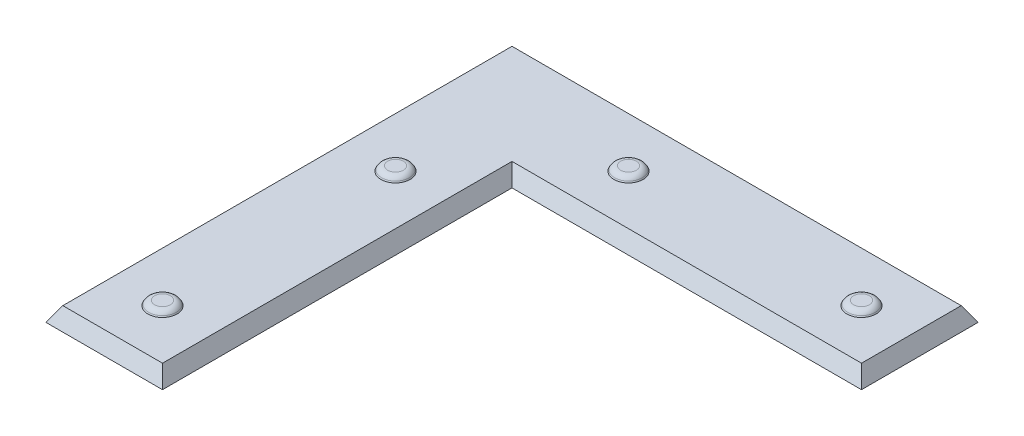
ISO-10303-21;
HEADER;
FILE_DESCRIPTION(('STEP AP214'),'2;1');
FILE_NAME('part.step','',(''),(''),'','','');
FILE_SCHEMA(('AUTOMOTIVE_DESIGN { 1 0 10303 214 1 1 1 1 }'));
ENDSEC;
DATA;
#1=APPLICATION_CONTEXT('core data for automotive mechanical design processes');
#2=APPLICATION_PROTOCOL_DEFINITION('international standard','automotive_design',2000,#1);
#3=PRODUCT_CONTEXT('',#1,'mechanical');
#4=PRODUCT('Part','Part','',(#3));
#5=PRODUCT_RELATED_PRODUCT_CATEGORY('part','',(#4));
#6=PRODUCT_DEFINITION_FORMATION('','',#4);
#7=PRODUCT_DEFINITION_CONTEXT('part definition',#1,'design');
#8=PRODUCT_DEFINITION('design','',#6,#7);
#9=PRODUCT_DEFINITION_SHAPE('','',#8);
#10=(LENGTH_UNIT() NAMED_UNIT(*) SI_UNIT(.MILLI.,.METRE.));
#11=(NAMED_UNIT(*) PLANE_ANGLE_UNIT() SI_UNIT($,.RADIAN.));
#12=(NAMED_UNIT(*) SI_UNIT($,.STERADIAN.) SOLID_ANGLE_UNIT());
#13=UNCERTAINTY_MEASURE_WITH_UNIT(LENGTH_MEASURE(1.E-05),#10,'distance_accuracy_value','');
#14=(GEOMETRIC_REPRESENTATION_CONTEXT(3) GLOBAL_UNCERTAINTY_ASSIGNED_CONTEXT((#13)) GLOBAL_UNIT_ASSIGNED_CONTEXT((#10,
#11,#12)) REPRESENTATION_CONTEXT('',''));
#15=CARTESIAN_POINT('',(0.,0.,0.));
#16=DIRECTION('',(0.,0.,1.));
#17=DIRECTION('',(1.,0.,0.));
#18=AXIS2_PLACEMENT_3D('',#15,#16,#17);
#19=CARTESIAN_POINT('',(-169.8625,16.66875,-61.9125));
#20=DIRECTION('',(0.,-1.,0.));
#21=DIRECTION('',(0.,0.,-1.));
#22=AXIS2_PLACEMENT_3D('',#19,#20,#21);
#23=PLANE('',#22);
#24=CARTESIAN_POINT('',(-160.3375,16.66875,-84.1375));
#25=DIRECTION('',(0.,-1.,0.));
#26=DIRECTION('',(0.,0.,-1.));
#27=AXIS2_PLACEMENT_3D('',#24,#25,#26);
#28=CIRCLE('',#27,0.793750000000019);
#29=CARTESIAN_POINT('',(-160.3375,16.66875,-84.93125));
#30=VERTEX_POINT('',#29);
#31=EDGE_CURVE('E147',#30,#30,#28,.F.);
#32=ORIENTED_EDGE('',*,*,#31,.F.);
#33=EDGE_LOOP('',(#32));
#34=FACE_BOUND('',#33,.T.);
#35=CARTESIAN_POINT('',(-166.6875,16.66875,-65.0875));
#36=DIRECTION('',(0.,-1.,0.));
#37=DIRECTION('',(0.,0.,-1.));
#38=AXIS2_PLACEMENT_3D('',#35,#36,#37);
#39=CIRCLE('',#38,0.793750000000019);
#40=CARTESIAN_POINT('',(-166.6875,16.66875,-65.88125));
#41=VERTEX_POINT('',#40);
#42=EDGE_CURVE('E107',#41,#41,#39,.F.);
#43=ORIENTED_EDGE('',*,*,#42,.F.);
#44=EDGE_LOOP('',(#43));
#45=FACE_BOUND('',#44,.T.);
#46=DIRECTION('',(-1.,0.,0.));
#47=VECTOR('',#46,1.);
#48=CARTESIAN_POINT('',(-169.8625,16.66875,-62.3707717761692));
#49=LINE('',#48,#47);
#50=CARTESIAN_POINT('',(-169.404228223831,16.66875,-62.3707717761692));
#51=VERTEX_POINT('',#50);
#52=CARTESIAN_POINT('',(-163.970771776169,16.66875,-62.3707717761692));
#53=VERTEX_POINT('',#52);
#54=EDGE_CURVE('E121',#51,#53,#49,.F.);
#55=ORIENTED_EDGE('',*,*,#54,.T.);
#56=DIRECTION('',(0.,0.,1.));
#57=VECTOR('',#56,1.);
#58=CARTESIAN_POINT('',(-163.970771776169,16.66875,-61.9125));
#59=LINE('',#58,#57);
#60=CARTESIAN_POINT('',(-163.970771776169,16.66875,-81.4207717761693));
#61=VERTEX_POINT('',#60);
#62=EDGE_CURVE('E104',#53,#61,#59,.F.);
#63=ORIENTED_EDGE('',*,*,#62,.T.);
#64=DIRECTION('',(-1.,0.,0.));
#65=VECTOR('',#64,1.);
#66=CARTESIAN_POINT('',(-169.8625,16.66875,-81.4207717761693));
#67=LINE('',#66,#65);
#68=CARTESIAN_POINT('',(-144.920771776169,16.66875,-81.4207717761693));
#69=VERTEX_POINT('',#68);
#70=EDGE_CURVE('E136',#61,#69,#67,.F.);
#71=ORIENTED_EDGE('',*,*,#70,.T.);
#72=DIRECTION('',(0.,0.,1.));
#73=VECTOR('',#72,1.);
#74=CARTESIAN_POINT('',(-144.920771776169,16.66875,-61.9125));
#75=LINE('',#74,#73);
#76=CARTESIAN_POINT('',(-144.920771776169,16.66875,-86.8542282238307));
#77=VERTEX_POINT('',#76);
#78=EDGE_CURVE('E138',#69,#77,#75,.F.);
#79=ORIENTED_EDGE('',*,*,#78,.T.);
#80=DIRECTION('',(1.,0.,0.));
#81=VECTOR('',#80,1.);
#82=CARTESIAN_POINT('',(-169.8625,16.66875,-86.8542282238307));
#83=LINE('',#82,#81);
#84=CARTESIAN_POINT('',(-169.404228223831,16.66875,-86.8542282238307));
#85=VERTEX_POINT('',#84);
#86=EDGE_CURVE('E56',#77,#85,#83,.F.);
#87=ORIENTED_EDGE('',*,*,#86,.T.);
#88=DIRECTION('',(0.,0.,-1.));
#89=VECTOR('',#88,1.);
#90=CARTESIAN_POINT('',(-169.404228223831,16.66875,-61.9125));
#91=LINE('',#90,#89);
#92=EDGE_CURVE('E51',#85,#51,#91,.F.);
#93=ORIENTED_EDGE('',*,*,#92,.T.);
#94=EDGE_LOOP('',(#55,#63,#71,#79,#87,#93));
#95=FACE_BOUND('',#94,.T.);
#96=CARTESIAN_POINT('',(-166.6875,16.66875,-77.7875));
#97=DIRECTION('',(0.,-1.,0.));
#98=DIRECTION('',(0.,0.,-1.));
#99=AXIS2_PLACEMENT_3D('',#96,#97,#98);
#100=CIRCLE('',#99,0.793750000000019);
#101=CARTESIAN_POINT('',(-166.6875,16.66875,-78.58125));
#102=VERTEX_POINT('',#101);
#103=EDGE_CURVE('E144',#102,#102,#100,.F.);
#104=ORIENTED_EDGE('',*,*,#103,.F.);
#105=EDGE_LOOP('',(#104));
#106=FACE_BOUND('',#105,.T.);
#107=CARTESIAN_POINT('',(-147.6375,16.66875,-84.1375));
#108=DIRECTION('',(0.,-1.,0.));
#109=DIRECTION('',(0.,0.,-1.));
#110=AXIS2_PLACEMENT_3D('',#107,#108,#109);
#111=CIRCLE('',#110,0.793750000000019);
#112=CARTESIAN_POINT('',(-147.6375,16.66875,-84.93125));
#113=VERTEX_POINT('',#112);
#114=EDGE_CURVE('E150',#113,#113,#111,.F.);
#115=ORIENTED_EDGE('',*,*,#114,.F.);
#116=EDGE_LOOP('',(#115));
#117=FACE_BOUND('',#116,.T.);
#118=ADVANCED_FACE('F36',(#34,#45,#95,#106,#117),#23,.F.);
#119=CARTESIAN_POINT('',(-163.5125,15.875,-61.9125));
#120=DIRECTION('',(0.,0.500000000000001,0.866025403784438));
#121=DIRECTION('',(0.,-0.866025403784438,0.500000000000001));
#122=AXIS2_PLACEMENT_3D('',#119,#120,#121);
#123=PLANE('',#122);
#124=DIRECTION('',(1.,0.,0.));
#125=VECTOR('',#124,1.);
#126=CARTESIAN_POINT('',(-163.5125,15.875,-61.9125));
#127=LINE('',#126,#125);
#128=CARTESIAN_POINT('',(-169.8625,15.875,-61.9125));
#129=VERTEX_POINT('',#128);
#130=CARTESIAN_POINT('',(-163.5125,15.875,-61.9125));
#131=VERTEX_POINT('',#130);
#132=EDGE_CURVE('E94',#129,#131,#127,.T.);
#133=ORIENTED_EDGE('',*,*,#132,.T.);
#134=DIRECTION('',(0.447213595499959,-0.774596669241483,0.447213595499958));
#135=VECTOR('',#134,1.);
#136=CARTESIAN_POINT('',(-167.3225,22.4741135768374,-65.7225));
#137=LINE('',#136,#135);
#138=EDGE_CURVE('E102',#53,#131,#137,.T.);
#139=ORIENTED_EDGE('',*,*,#138,.F.);
#140=ORIENTED_EDGE('',*,*,#54,.F.);
#141=DIRECTION('',(-0.447213595499958,-0.774596669241482,0.447213595499959));
#142=VECTOR('',#141,1.);
#143=CARTESIAN_POINT('',(-168.5925,18.0747045256125,-63.1825));
#144=LINE('',#143,#142);
#145=EDGE_CURVE('E112',#51,#129,#144,.T.);
#146=ORIENTED_EDGE('',*,*,#145,.T.);
#147=EDGE_LOOP('',(#133,#139,#140,#146));
#148=FACE_BOUND('',#147,.T.);
#149=ADVANCED_FACE('F111',(#148),#123,.T.);
#150=CARTESIAN_POINT('',(-163.5125,15.875,-80.9625));
#151=DIRECTION('',(0.866025403784438,0.500000000000001,0.));
#152=DIRECTION('',(-0.500000000000001,0.866025403784438,0.));
#153=AXIS2_PLACEMENT_3D('',#150,#151,#152);
#154=PLANE('',#153);
#155=DIRECTION('',(0.,0.,-1.));
#156=VECTOR('',#155,1.);
#157=CARTESIAN_POINT('',(-163.5125,15.875,-80.9625));
#158=LINE('',#157,#156);
#159=CARTESIAN_POINT('',(-163.5125,15.875,-80.9625));
#160=VERTEX_POINT('',#159);
#161=EDGE_CURVE('E89',#131,#160,#158,.T.);
#162=ORIENTED_EDGE('',*,*,#161,.T.);
#163=DIRECTION('',(0.447213595499959,-0.774596669241482,0.447213595499959));
#164=VECTOR('',#163,1.);
#165=CARTESIAN_POINT('',(-163.5125,15.875,-80.9625));
#166=LINE('',#165,#164);
#167=EDGE_CURVE('E108',#61,#160,#166,.T.);
#168=ORIENTED_EDGE('',*,*,#167,.F.);
#169=ORIENTED_EDGE('',*,*,#62,.F.);
#170=ORIENTED_EDGE('',*,*,#138,.T.);
#171=EDGE_LOOP('',(#162,#168,#169,#170));
#172=FACE_BOUND('',#171,.T.);
#173=ADVANCED_FACE('F103',(#172),#154,.T.);
#174=CARTESIAN_POINT('',(-144.4625,15.875,-80.9625));
#175=DIRECTION('',(0.,0.500000000000001,0.866025403784438));
#176=DIRECTION('',(0.,-0.866025403784438,0.500000000000001));
#177=AXIS2_PLACEMENT_3D('',#174,#175,#176);
#178=PLANE('',#177);
#179=DIRECTION('',(1.,0.,0.));
#180=VECTOR('',#179,1.);
#181=CARTESIAN_POINT('',(-144.4625,15.875,-80.9625));
#182=LINE('',#181,#180);
#183=CARTESIAN_POINT('',(-144.4625,15.875,-80.9625));
#184=VERTEX_POINT('',#183);
#185=EDGE_CURVE('E96',#160,#184,#182,.T.);
#186=ORIENTED_EDGE('',*,*,#185,.T.);
#187=DIRECTION('',(0.447213595499959,-0.774596669241482,0.447213595499959));
#188=VECTOR('',#187,1.);
#189=CARTESIAN_POINT('',(-145.7325,18.0747045256125,-82.2325));
#190=LINE('',#189,#188);
#191=EDGE_CURVE('E130',#69,#184,#190,.T.);
#192=ORIENTED_EDGE('',*,*,#191,.F.);
#193=ORIENTED_EDGE('',*,*,#70,.F.);
#194=ORIENTED_EDGE('',*,*,#167,.T.);
#195=EDGE_LOOP('',(#186,#192,#193,#194));
#196=FACE_BOUND('',#195,.T.);
#197=ADVANCED_FACE('F210',(#196),#178,.T.);
#198=CARTESIAN_POINT('',(-144.4625,15.875,-87.3125));
#199=DIRECTION('',(0.866025403784438,0.500000000000001,0.));
#200=DIRECTION('',(-0.500000000000001,0.866025403784438,0.));
#201=AXIS2_PLACEMENT_3D('',#198,#199,#200);
#202=PLANE('',#201);
#203=DIRECTION('',(0.,0.,-1.));
#204=VECTOR('',#203,1.);
#205=CARTESIAN_POINT('',(-144.4625,15.875,-87.3125));
#206=LINE('',#205,#204);
#207=CARTESIAN_POINT('',(-144.4625,15.875,-87.3125));
#208=VERTEX_POINT('',#207);
#209=EDGE_CURVE('E116',#184,#208,#206,.T.);
#210=ORIENTED_EDGE('',*,*,#209,.T.);
#211=DIRECTION('',(0.447213595499959,-0.774596669241482,-0.447213595499959));
#212=VECTOR('',#211,1.);
#213=CARTESIAN_POINT('',(-149.5425,24.6738181024499,-82.2325));
#214=LINE('',#213,#212);
#215=EDGE_CURVE('E127',#77,#208,#214,.T.);
#216=ORIENTED_EDGE('',*,*,#215,.F.);
#217=ORIENTED_EDGE('',*,*,#78,.F.);
#218=ORIENTED_EDGE('',*,*,#191,.T.);
#219=EDGE_LOOP('',(#210,#216,#217,#218));
#220=FACE_BOUND('',#219,.T.);
#221=ADVANCED_FACE('F206',(#220),#202,.T.);
#222=CARTESIAN_POINT('',(-169.8625,15.875,-87.3125));
#223=DIRECTION('',(0.,0.500000000000001,-0.866025403784438));
#224=DIRECTION('',(0.,0.866025403784438,0.500000000000001));
#225=AXIS2_PLACEMENT_3D('',#222,#223,#224);
#226=PLANE('',#225);
#227=DIRECTION('',(-1.,0.,0.));
#228=VECTOR('',#227,1.);
#229=CARTESIAN_POINT('',(-169.8625,15.875,-87.3125));
#230=LINE('',#229,#228);
#231=CARTESIAN_POINT('',(-169.8625,15.875,-87.3125));
#232=VERTEX_POINT('',#231);
#233=EDGE_CURVE('E118',#208,#232,#230,.T.);
#234=ORIENTED_EDGE('',*,*,#233,.T.);
#235=DIRECTION('',(-0.447213595499959,-0.774596669241482,-0.447213595499959));
#236=VECTOR('',#235,1.);
#237=CARTESIAN_POINT('',(-164.7825,24.6738181024499,-82.2325));
#238=LINE('',#237,#236);
#239=EDGE_CURVE('E124',#85,#232,#238,.T.);
#240=ORIENTED_EDGE('',*,*,#239,.F.);
#241=ORIENTED_EDGE('',*,*,#86,.F.);
#242=ORIENTED_EDGE('',*,*,#215,.T.);
#243=EDGE_LOOP('',(#234,#240,#241,#242));
#244=FACE_BOUND('',#243,.T.);
#245=ADVANCED_FACE('F202',(#244),#226,.T.);
#246=CARTESIAN_POINT('',(-169.8625,15.875,-61.9125));
#247=DIRECTION('',(-0.866025403784438,0.500000000000001,0.));
#248=DIRECTION('',(-0.500000000000001,-0.866025403784438,0.));
#249=AXIS2_PLACEMENT_3D('',#246,#247,#248);
#250=PLANE('',#249);
#251=DIRECTION('',(0.,0.,1.));
#252=VECTOR('',#251,1.);
#253=CARTESIAN_POINT('',(-169.8625,15.875,-61.9125));
#254=LINE('',#253,#252);
#255=EDGE_CURVE('E120',#232,#129,#254,.T.);
#256=ORIENTED_EDGE('',*,*,#255,.T.);
#257=ORIENTED_EDGE('',*,*,#145,.F.);
#258=ORIENTED_EDGE('',*,*,#92,.F.);
#259=ORIENTED_EDGE('',*,*,#239,.T.);
#260=EDGE_LOOP('',(#256,#257,#258,#259));
#261=FACE_BOUND('',#260,.T.);
#262=ADVANCED_FACE('F198',(#261),#250,.T.);
#263=CARTESIAN_POINT('',(-169.8625,15.875,-61.9125));
#264=DIRECTION('',(0.,-1.,0.));
#265=DIRECTION('',(0.,0.,-1.));
#266=AXIS2_PLACEMENT_3D('',#263,#264,#265);
#267=PLANE('',#266);
#268=ORIENTED_EDGE('',*,*,#132,.F.);
#269=ORIENTED_EDGE('',*,*,#255,.F.);
#270=ORIENTED_EDGE('',*,*,#233,.F.);
#271=ORIENTED_EDGE('',*,*,#209,.F.);
#272=ORIENTED_EDGE('',*,*,#185,.F.);
#273=ORIENTED_EDGE('',*,*,#161,.F.);
#274=EDGE_LOOP('',(#268,#269,#270,#271,#272,#273));
#275=FACE_BOUND('',#274,.T.);
#276=ADVANCED_FACE('F91',(#275),#267,.T.);
#277=CARTESIAN_POINT('',(-166.6875,16.66875,-65.0875));
#278=DIRECTION('',(0.,-1.,0.));
#279=DIRECTION('',(0.,0.,1.));
#280=AXIS2_PLACEMENT_3D('',#277,#278,#279);
#281=CONICAL_SURFACE('',#280,0.793750000000019,0.5235987755983);
#282=CARTESIAN_POINT('',(-166.6875,16.73225,-65.0875));
#283=DIRECTION('',(0.,-1.,0.));
#284=DIRECTION('',(0.,0.,-1.));
#285=AXIS2_PLACEMENT_3D('',#282,#283,#284);
#286=CIRCLE('',#285,0.757088257906477);
#287=CARTESIAN_POINT('',(-166.6875,16.73225,-65.8445882579065));
#288=VERTEX_POINT('',#287);
#289=EDGE_CURVE('E11',#288,#288,#286,.T.);
#290=ORIENTED_EDGE('',*,*,#289,.T.);
#291=EDGE_LOOP('',(#290));
#292=FACE_BOUND('',#291,.T.);
#293=ORIENTED_EDGE('',*,*,#42,.T.);
#294=EDGE_LOOP('',(#293));
#295=FACE_BOUND('',#294,.T.);
#296=ADVANCED_FACE('F195',(#292,#295),#281,.T.);
#297=CARTESIAN_POINT('',(-166.6875,16.92275,-65.0875));
#298=DIRECTION('',(0.,1.,0.));
#299=DIRECTION('',(0.,0.,1.));
#300=AXIS2_PLACEMENT_3D('',#297,#298,#299);
#301=PLANE('',#300);
#302=CARTESIAN_POINT('',(-166.6875,16.92275,-65.0875));
#303=DIRECTION('',(0.,1.,0.));
#304=DIRECTION('',(0.,0.,1.));
#305=AXIS2_PLACEMENT_3D('',#302,#303,#304);
#306=CIRCLE('',#305,0.427132579064606);
#307=CARTESIAN_POINT('',(-166.6875,16.92275,-64.6603674209354));
#308=VERTEX_POINT('',#307);
#309=EDGE_CURVE('E44',#308,#308,#306,.T.);
#310=ORIENTED_EDGE('',*,*,#309,.T.);
#311=EDGE_LOOP('',(#310));
#312=FACE_BOUND('',#311,.T.);
#313=ADVANCED_FACE('F173',(#312),#301,.T.);
#314=CARTESIAN_POINT('',(-166.6875,16.66875,-77.7875));
#315=DIRECTION('',(0.,-1.,0.));
#316=DIRECTION('',(0.,0.,1.));
#317=AXIS2_PLACEMENT_3D('',#314,#315,#316);
#318=CONICAL_SURFACE('',#317,0.793750000000019,0.5235987755983);
#319=CARTESIAN_POINT('',(-166.6875,16.73225,-77.7875));
#320=DIRECTION('',(0.,-1.,0.));
#321=DIRECTION('',(0.,0.,-1.));
#322=AXIS2_PLACEMENT_3D('',#319,#320,#321);
#323=CIRCLE('',#322,0.757088257906477);
#324=CARTESIAN_POINT('',(-166.6875,16.73225,-78.5445882579065));
#325=VERTEX_POINT('',#324);
#326=EDGE_CURVE('E168',#325,#325,#323,.T.);
#327=ORIENTED_EDGE('',*,*,#326,.T.);
#328=EDGE_LOOP('',(#327));
#329=FACE_BOUND('',#328,.T.);
#330=ORIENTED_EDGE('',*,*,#103,.T.);
#331=EDGE_LOOP('',(#330));
#332=FACE_BOUND('',#331,.T.);
#333=ADVANCED_FACE('F248',(#329,#332),#318,.T.);
#334=CARTESIAN_POINT('',(-166.6875,16.92275,-77.7875));
#335=DIRECTION('',(0.,1.,0.));
#336=DIRECTION('',(0.,0.,1.));
#337=AXIS2_PLACEMENT_3D('',#334,#335,#336);
#338=PLANE('',#337);
#339=CARTESIAN_POINT('',(-166.6875,16.92275,-77.7875));
#340=DIRECTION('',(0.,1.,0.));
#341=DIRECTION('',(0.,0.,1.));
#342=AXIS2_PLACEMENT_3D('',#339,#340,#341);
#343=CIRCLE('',#342,0.427132579064606);
#344=CARTESIAN_POINT('',(-166.6875,16.92275,-77.3603674209354));
#345=VERTEX_POINT('',#344);
#346=EDGE_CURVE('E165',#345,#345,#343,.T.);
#347=ORIENTED_EDGE('',*,*,#346,.T.);
#348=EDGE_LOOP('',(#347));
#349=FACE_BOUND('',#348,.T.);
#350=ADVANCED_FACE('F241',(#349),#338,.T.);
#351=CARTESIAN_POINT('',(-160.3375,16.66875,-84.1375));
#352=DIRECTION('',(0.,-1.,0.));
#353=DIRECTION('',(0.,0.,1.));
#354=AXIS2_PLACEMENT_3D('',#351,#352,#353);
#355=CONICAL_SURFACE('',#354,0.793750000000019,0.5235987755983);
#356=CARTESIAN_POINT('',(-160.3375,16.73225,-84.1375));
#357=DIRECTION('',(0.,-1.,0.));
#358=DIRECTION('',(0.,0.,-1.));
#359=AXIS2_PLACEMENT_3D('',#356,#357,#358);
#360=CIRCLE('',#359,0.757088257906477);
#361=CARTESIAN_POINT('',(-160.3375,16.73225,-84.8945882579065));
#362=VERTEX_POINT('',#361);
#363=EDGE_CURVE('E162',#362,#362,#360,.T.);
#364=ORIENTED_EDGE('',*,*,#363,.T.);
#365=EDGE_LOOP('',(#364));
#366=FACE_BOUND('',#365,.T.);
#367=ORIENTED_EDGE('',*,*,#31,.T.);
#368=EDGE_LOOP('',(#367));
#369=FACE_BOUND('',#368,.T.);
#370=ADVANCED_FACE('F233',(#366,#369),#355,.T.);
#371=CARTESIAN_POINT('',(-160.3375,16.92275,-84.1375));
#372=DIRECTION('',(0.,1.,0.));
#373=DIRECTION('',(0.,0.,1.));
#374=AXIS2_PLACEMENT_3D('',#371,#372,#373);
#375=PLANE('',#374);
#376=CARTESIAN_POINT('',(-160.3375,16.92275,-84.1375));
#377=DIRECTION('',(0.,1.,0.));
#378=DIRECTION('',(0.,0.,1.));
#379=AXIS2_PLACEMENT_3D('',#376,#377,#378);
#380=CIRCLE('',#379,0.427132579064606);
#381=CARTESIAN_POINT('',(-160.3375,16.92275,-83.7103674209354));
#382=VERTEX_POINT('',#381);
#383=EDGE_CURVE('E159',#382,#382,#380,.T.);
#384=ORIENTED_EDGE('',*,*,#383,.T.);
#385=EDGE_LOOP('',(#384));
#386=FACE_BOUND('',#385,.T.);
#387=ADVANCED_FACE('F230',(#386),#375,.T.);
#388=CARTESIAN_POINT('',(-147.6375,16.66875,-84.1375));
#389=DIRECTION('',(0.,-1.,0.));
#390=DIRECTION('',(0.,0.,1.));
#391=AXIS2_PLACEMENT_3D('',#388,#389,#390);
#392=CONICAL_SURFACE('',#391,0.793750000000019,0.5235987755983);
#393=CARTESIAN_POINT('',(-147.6375,16.73225,-84.1375));
#394=DIRECTION('',(0.,-1.,0.));
#395=DIRECTION('',(0.,0.,-1.));
#396=AXIS2_PLACEMENT_3D('',#393,#394,#395);
#397=CIRCLE('',#396,0.757088257906477);
#398=CARTESIAN_POINT('',(-147.6375,16.73225,-84.8945882579065));
#399=VERTEX_POINT('',#398);
#400=EDGE_CURVE('E156',#399,#399,#397,.T.);
#401=ORIENTED_EDGE('',*,*,#400,.T.);
#402=EDGE_LOOP('',(#401));
#403=FACE_BOUND('',#402,.T.);
#404=ORIENTED_EDGE('',*,*,#114,.T.);
#405=EDGE_LOOP('',(#404));
#406=FACE_BOUND('',#405,.T.);
#407=ADVANCED_FACE('F232',(#403,#406),#392,.T.);
#408=CARTESIAN_POINT('',(-147.6375,16.92275,-84.1375));
#409=DIRECTION('',(0.,1.,0.));
#410=DIRECTION('',(0.,0.,1.));
#411=AXIS2_PLACEMENT_3D('',#408,#409,#410);
#412=PLANE('',#411);
#413=CARTESIAN_POINT('',(-147.6375,16.92275,-84.1375));
#414=DIRECTION('',(0.,1.,0.));
#415=DIRECTION('',(0.,0.,1.));
#416=AXIS2_PLACEMENT_3D('',#413,#414,#415);
#417=CIRCLE('',#416,0.427132579064606);
#418=CARTESIAN_POINT('',(-147.6375,16.92275,-83.7103674209354));
#419=VERTEX_POINT('',#418);
#420=EDGE_CURVE('E153',#419,#419,#417,.T.);
#421=ORIENTED_EDGE('',*,*,#420,.T.);
#422=EDGE_LOOP('',(#421));
#423=FACE_BOUND('',#422,.T.);
#424=ADVANCED_FACE('F220',(#423),#412,.T.);
#425=CARTESIAN_POINT('',(-147.6375,16.54175,-84.1375));
#426=DIRECTION('',(0.,1.,0.));
#427=DIRECTION('',(0.,0.,1.));
#428=AXIS2_PLACEMENT_3D('',#425,#426,#427);
#429=TOROIDAL_SURFACE('',#428,0.427132579064606,0.381);
#430=ORIENTED_EDGE('',*,*,#400,.F.);
#431=EDGE_LOOP('',(#430));
#432=FACE_BOUND('',#431,.T.);
#433=ORIENTED_EDGE('',*,*,#420,.F.);
#434=EDGE_LOOP('',(#433));
#435=FACE_BOUND('',#434,.T.);
#436=ADVANCED_FACE('F217',(#432,#435),#429,.T.);
#437=CARTESIAN_POINT('',(-160.3375,16.54175,-84.1375));
#438=DIRECTION('',(0.,1.,0.));
#439=DIRECTION('',(0.,0.,1.));
#440=AXIS2_PLACEMENT_3D('',#437,#438,#439);
#441=TOROIDAL_SURFACE('',#440,0.427132579064606,0.381);
#442=ORIENTED_EDGE('',*,*,#363,.F.);
#443=EDGE_LOOP('',(#442));
#444=FACE_BOUND('',#443,.T.);
#445=ORIENTED_EDGE('',*,*,#383,.F.);
#446=EDGE_LOOP('',(#445));
#447=FACE_BOUND('',#446,.T.);
#448=ADVANCED_FACE('F181',(#444,#447),#441,.T.);
#449=CARTESIAN_POINT('',(-166.6875,16.54175,-77.7875));
#450=DIRECTION('',(0.,1.,0.));
#451=DIRECTION('',(0.,0.,1.));
#452=AXIS2_PLACEMENT_3D('',#449,#450,#451);
#453=TOROIDAL_SURFACE('',#452,0.427132579064606,0.381);
#454=ORIENTED_EDGE('',*,*,#326,.F.);
#455=EDGE_LOOP('',(#454));
#456=FACE_BOUND('',#455,.T.);
#457=ORIENTED_EDGE('',*,*,#346,.F.);
#458=EDGE_LOOP('',(#457));
#459=FACE_BOUND('',#458,.T.);
#460=ADVANCED_FACE('F176',(#456,#459),#453,.T.);
#461=CARTESIAN_POINT('',(-166.6875,16.54175,-65.0875));
#462=DIRECTION('',(0.,1.,0.));
#463=DIRECTION('',(0.,0.,1.));
#464=AXIS2_PLACEMENT_3D('',#461,#462,#463);
#465=TOROIDAL_SURFACE('',#464,0.427132579064606,0.381);
#466=ORIENTED_EDGE('',*,*,#289,.F.);
#467=EDGE_LOOP('',(#466));
#468=FACE_BOUND('',#467,.T.);
#469=ORIENTED_EDGE('',*,*,#309,.F.);
#470=EDGE_LOOP('',(#469));
#471=FACE_BOUND('',#470,.T.);
#472=ADVANCED_FACE('F38',(#468,#471),#465,.T.);
#473=CLOSED_SHELL('',(#118,#149,#173,#197,#221,#245,#262,#276,#296,#313,#333,#350,#370,#387,
#407,#424,#436,#448,#460,#472));
#474=MANIFOLD_SOLID_BREP('B2',#473);
#475=ADVANCED_BREP_SHAPE_REPRESENTATION('',(#18,#474),#14);
#476=SHAPE_DEFINITION_REPRESENTATION(#9,#475);
ENDSEC;
END-ISO-10303-21;
